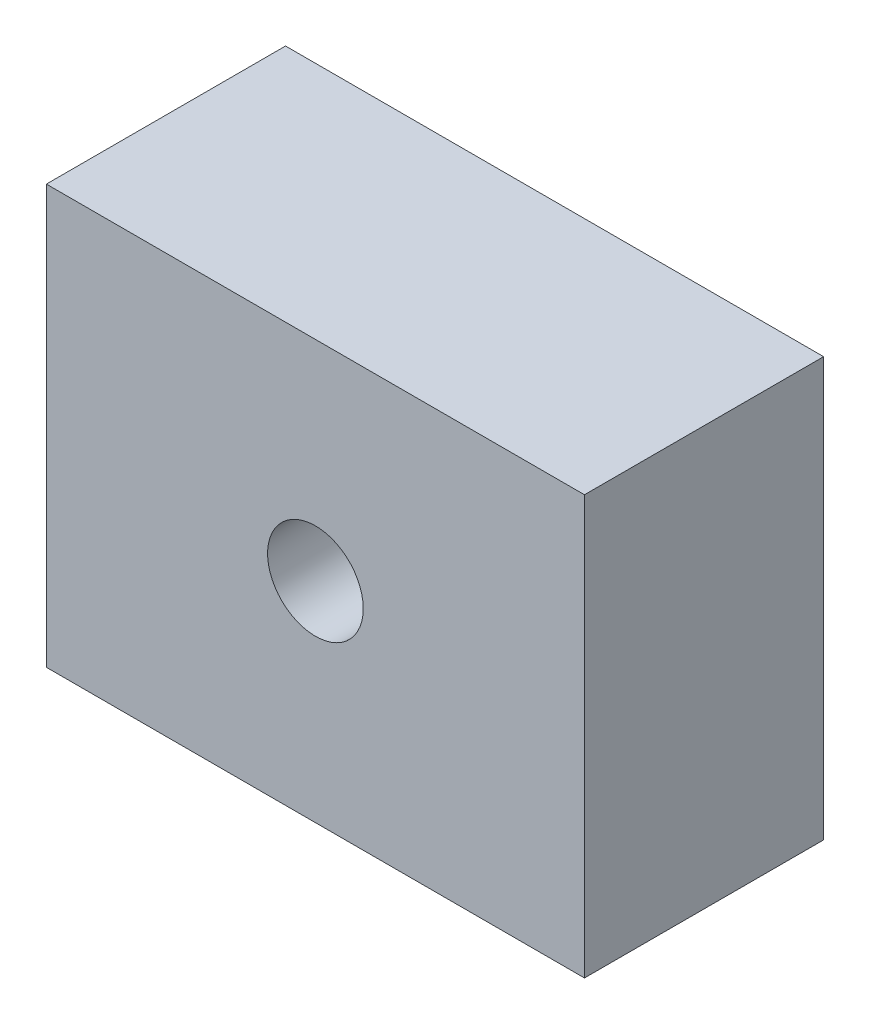
ISO-10303-21;
HEADER;
FILE_DESCRIPTION(('STEP AP214'),'2;1');
FILE_NAME('part.step','',(''),(''),'','','');
FILE_SCHEMA(('AUTOMOTIVE_DESIGN { 1 0 10303 214 1 1 1 1 }'));
ENDSEC;
DATA;
#1=APPLICATION_CONTEXT('core data for automotive mechanical design processes');
#2=APPLICATION_PROTOCOL_DEFINITION('international standard','automotive_design',2000,#1);
#3=PRODUCT_CONTEXT('',#1,'mechanical');
#4=PRODUCT('Part','Part','',(#3));
#5=PRODUCT_RELATED_PRODUCT_CATEGORY('part','',(#4));
#6=PRODUCT_DEFINITION_FORMATION('','',#4);
#7=PRODUCT_DEFINITION_CONTEXT('part definition',#1,'design');
#8=PRODUCT_DEFINITION('design','',#6,#7);
#9=PRODUCT_DEFINITION_SHAPE('','',#8);
#10=(LENGTH_UNIT() NAMED_UNIT(*) SI_UNIT(.MILLI.,.METRE.));
#11=(NAMED_UNIT(*) PLANE_ANGLE_UNIT() SI_UNIT($,.RADIAN.));
#12=(NAMED_UNIT(*) SI_UNIT($,.STERADIAN.) SOLID_ANGLE_UNIT());
#13=UNCERTAINTY_MEASURE_WITH_UNIT(LENGTH_MEASURE(1.E-05),#10,'distance_accuracy_value','');
#14=(GEOMETRIC_REPRESENTATION_CONTEXT(3) GLOBAL_UNCERTAINTY_ASSIGNED_CONTEXT((#13)) GLOBAL_UNIT_ASSIGNED_CONTEXT((#10,
#11,#12)) REPRESENTATION_CONTEXT('',''));
#15=CARTESIAN_POINT('',(0.,0.,0.));
#16=DIRECTION('',(0.,0.,1.));
#17=DIRECTION('',(1.,0.,0.));
#18=AXIS2_PLACEMENT_3D('',#15,#16,#17);
#19=CARTESIAN_POINT('',(0.,0.,20.));
#20=DIRECTION('',(1.,0.,0.));
#21=DIRECTION('',(0.,0.,-1.));
#22=AXIS2_PLACEMENT_3D('',#19,#20,#21);
#23=PLANE('',#22);
#24=DIRECTION('',(0.,-1.,0.));
#25=VECTOR('',#24,1.);
#26=CARTESIAN_POINT('',(0.,0.,0.));
#27=LINE('',#26,#25);
#28=CARTESIAN_POINT('',(0.,35.,0.));
#29=VERTEX_POINT('',#28);
#30=CARTESIAN_POINT('',(0.,0.,0.));
#31=VERTEX_POINT('',#30);
#32=EDGE_CURVE('E96',#29,#31,#27,.T.);
#33=ORIENTED_EDGE('',*,*,#32,.T.);
#34=DIRECTION('',(0.,0.,-1.));
#35=VECTOR('',#34,1.);
#36=CARTESIAN_POINT('',(0.,0.,20.));
#37=LINE('',#36,#35);
#38=CARTESIAN_POINT('',(0.,0.,20.));
#39=VERTEX_POINT('',#38);
#40=EDGE_CURVE('E11',#39,#31,#37,.T.);
#41=ORIENTED_EDGE('',*,*,#40,.F.);
#42=DIRECTION('',(0.,-1.,0.));
#43=VECTOR('',#42,1.);
#44=CARTESIAN_POINT('',(0.,0.,20.));
#45=LINE('',#44,#43);
#46=CARTESIAN_POINT('',(0.,35.,20.));
#47=VERTEX_POINT('',#46);
#48=EDGE_CURVE('E84',#47,#39,#45,.T.);
#49=ORIENTED_EDGE('',*,*,#48,.F.);
#50=DIRECTION('',(0.,0.,-1.));
#51=VECTOR('',#50,1.);
#52=CARTESIAN_POINT('',(0.,35.,20.));
#53=LINE('',#52,#51);
#54=EDGE_CURVE('E92',#47,#29,#53,.T.);
#55=ORIENTED_EDGE('',*,*,#54,.T.);
#56=EDGE_LOOP('',(#33,#41,#49,#55));
#57=FACE_BOUND('',#56,.T.);
#58=ADVANCED_FACE('F33',(#57),#23,.F.);
#59=CARTESIAN_POINT('',(0.,0.,20.));
#60=DIRECTION('',(0.,1.,0.));
#61=DIRECTION('',(0.,0.,1.));
#62=AXIS2_PLACEMENT_3D('',#59,#60,#61);
#63=PLANE('',#62);
#64=DIRECTION('',(1.,0.,0.));
#65=VECTOR('',#64,1.);
#66=CARTESIAN_POINT('',(0.,0.,0.));
#67=LINE('',#66,#65);
#68=CARTESIAN_POINT('',(45.,0.,0.));
#69=VERTEX_POINT('',#68);
#70=EDGE_CURVE('E88',#31,#69,#67,.T.);
#71=ORIENTED_EDGE('',*,*,#70,.T.);
#72=DIRECTION('',(0.,0.,-1.));
#73=VECTOR('',#72,1.);
#74=CARTESIAN_POINT('',(45.,0.,20.));
#75=LINE('',#74,#73);
#76=CARTESIAN_POINT('',(45.,0.,20.));
#77=VERTEX_POINT('',#76);
#78=EDGE_CURVE('E41',#77,#69,#75,.T.);
#79=ORIENTED_EDGE('',*,*,#78,.F.);
#80=DIRECTION('',(1.,0.,0.));
#81=VECTOR('',#80,1.);
#82=CARTESIAN_POINT('',(0.,0.,20.));
#83=LINE('',#82,#81);
#84=EDGE_CURVE('E79',#39,#77,#83,.T.);
#85=ORIENTED_EDGE('',*,*,#84,.F.);
#86=ORIENTED_EDGE('',*,*,#40,.T.);
#87=EDGE_LOOP('',(#71,#79,#85,#86));
#88=FACE_BOUND('',#87,.T.);
#89=ADVANCED_FACE('F87',(#88),#63,.F.);
#90=CARTESIAN_POINT('',(45.,0.,20.));
#91=DIRECTION('',(-1.,0.,0.));
#92=DIRECTION('',(0.,0.,1.));
#93=AXIS2_PLACEMENT_3D('',#90,#91,#92);
#94=PLANE('',#93);
#95=DIRECTION('',(0.,1.,0.));
#96=VECTOR('',#95,1.);
#97=CARTESIAN_POINT('',(45.,0.,0.));
#98=LINE('',#97,#96);
#99=CARTESIAN_POINT('',(45.,35.,0.));
#100=VERTEX_POINT('',#99);
#101=EDGE_CURVE('E66',#69,#100,#98,.T.);
#102=ORIENTED_EDGE('',*,*,#101,.T.);
#103=DIRECTION('',(0.,0.,-1.));
#104=VECTOR('',#103,1.);
#105=CARTESIAN_POINT('',(45.,35.,20.));
#106=LINE('',#105,#104);
#107=CARTESIAN_POINT('',(45.,35.,20.));
#108=VERTEX_POINT('',#107);
#109=EDGE_CURVE('E89',#108,#100,#106,.T.);
#110=ORIENTED_EDGE('',*,*,#109,.F.);
#111=DIRECTION('',(0.,1.,0.));
#112=VECTOR('',#111,1.);
#113=CARTESIAN_POINT('',(45.,0.,20.));
#114=LINE('',#113,#112);
#115=EDGE_CURVE('E82',#77,#108,#114,.T.);
#116=ORIENTED_EDGE('',*,*,#115,.F.);
#117=ORIENTED_EDGE('',*,*,#78,.T.);
#118=EDGE_LOOP('',(#102,#110,#116,#117));
#119=FACE_BOUND('',#118,.T.);
#120=ADVANCED_FACE('F90',(#119),#94,.F.);
#121=CARTESIAN_POINT('',(0.,35.,20.));
#122=DIRECTION('',(0.,-1.,0.));
#123=DIRECTION('',(0.,0.,-1.));
#124=AXIS2_PLACEMENT_3D('',#121,#122,#123);
#125=PLANE('',#124);
#126=DIRECTION('',(-1.,0.,0.));
#127=VECTOR('',#126,1.);
#128=CARTESIAN_POINT('',(0.,35.,0.));
#129=LINE('',#128,#127);
#130=EDGE_CURVE('E72',#100,#29,#129,.T.);
#131=ORIENTED_EDGE('',*,*,#130,.T.);
#132=ORIENTED_EDGE('',*,*,#54,.F.);
#133=DIRECTION('',(-1.,0.,0.));
#134=VECTOR('',#133,1.);
#135=CARTESIAN_POINT('',(0.,35.,20.));
#136=LINE('',#135,#134);
#137=EDGE_CURVE('E49',#108,#47,#136,.T.);
#138=ORIENTED_EDGE('',*,*,#137,.F.);
#139=ORIENTED_EDGE('',*,*,#109,.T.);
#140=EDGE_LOOP('',(#131,#132,#138,#139));
#141=FACE_BOUND('',#140,.T.);
#142=ADVANCED_FACE('F104',(#141),#125,.F.);
#143=CARTESIAN_POINT('',(0.,0.,20.));
#144=DIRECTION('',(0.,0.,-1.));
#145=DIRECTION('',(-1.,0.,0.));
#146=AXIS2_PLACEMENT_3D('',#143,#144,#145);
#147=PLANE('',#146);
#148=CARTESIAN_POINT('',(22.5,17.5,20.));
#149=DIRECTION('',(0.,0.,1.));
#150=DIRECTION('',(1.,0.,0.));
#151=AXIS2_PLACEMENT_3D('',#148,#149,#150);
#152=CIRCLE('',#151,4.);
#153=CARTESIAN_POINT('',(26.5,17.5,20.));
#154=VERTEX_POINT('',#153);
#155=EDGE_CURVE('E110',#154,#154,#152,.T.);
#156=ORIENTED_EDGE('',*,*,#155,.F.);
#157=EDGE_LOOP('',(#156));
#158=FACE_BOUND('',#157,.T.);
#159=ORIENTED_EDGE('',*,*,#48,.T.);
#160=ORIENTED_EDGE('',*,*,#84,.T.);
#161=ORIENTED_EDGE('',*,*,#115,.T.);
#162=ORIENTED_EDGE('',*,*,#137,.T.);
#163=EDGE_LOOP('',(#159,#160,#161,#162));
#164=FACE_BOUND('',#163,.T.);
#165=ADVANCED_FACE('F80',(#158,#164),#147,.F.);
#166=CARTESIAN_POINT('',(0.,0.,0.));
#167=DIRECTION('',(0.,0.,-1.));
#168=DIRECTION('',(-1.,0.,0.));
#169=AXIS2_PLACEMENT_3D('',#166,#167,#168);
#170=PLANE('',#169);
#171=CARTESIAN_POINT('',(22.5,17.5,0.));
#172=DIRECTION('',(0.,0.,1.));
#173=DIRECTION('',(1.,0.,0.));
#174=AXIS2_PLACEMENT_3D('',#171,#172,#173);
#175=CIRCLE('',#174,4.);
#176=CARTESIAN_POINT('',(26.5,17.5,0.));
#177=VERTEX_POINT('',#176);
#178=EDGE_CURVE('E99',#177,#177,#175,.T.);
#179=ORIENTED_EDGE('',*,*,#178,.T.);
#180=EDGE_LOOP('',(#179));
#181=FACE_BOUND('',#180,.T.);
#182=ORIENTED_EDGE('',*,*,#32,.F.);
#183=ORIENTED_EDGE('',*,*,#130,.F.);
#184=ORIENTED_EDGE('',*,*,#101,.F.);
#185=ORIENTED_EDGE('',*,*,#70,.F.);
#186=EDGE_LOOP('',(#182,#183,#184,#185));
#187=FACE_BOUND('',#186,.T.);
#188=ADVANCED_FACE('F107',(#181,#187),#170,.T.);
#189=CARTESIAN_POINT('',(22.5,17.5,0.));
#190=DIRECTION('',(0.,0.,1.));
#191=DIRECTION('',(1.,0.,0.));
#192=AXIS2_PLACEMENT_3D('',#189,#190,#191);
#193=CYLINDRICAL_SURFACE('',#192,4.);
#194=ORIENTED_EDGE('',*,*,#178,.F.);
#195=EDGE_LOOP('',(#194));
#196=FACE_BOUND('',#195,.T.);
#197=ORIENTED_EDGE('',*,*,#155,.T.);
#198=EDGE_LOOP('',(#197));
#199=FACE_BOUND('',#198,.T.);
#200=ADVANCED_FACE('F117',(#196,#199),#193,.F.);
#201=CLOSED_SHELL('',(#58,#89,#120,#142,#165,#188,#200));
#202=MANIFOLD_SOLID_BREP('B2',#201);
#203=ADVANCED_BREP_SHAPE_REPRESENTATION('',(#18,#202),#14);
#204=SHAPE_DEFINITION_REPRESENTATION(#9,#203);
ENDSEC;
END-ISO-10303-21;
